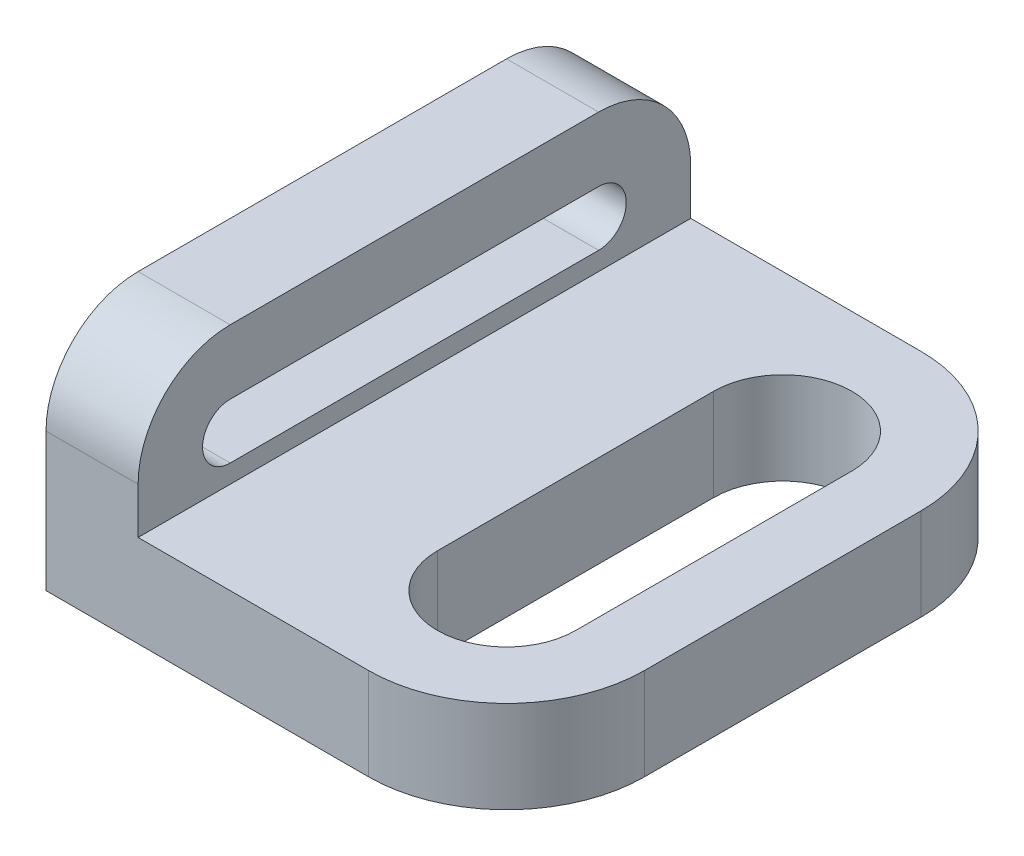
ISO-10303-21;
HEADER;
FILE_DESCRIPTION(('STEP AP214'),'2;1');
FILE_NAME('part.step','',(''),(''),'','','');
FILE_SCHEMA(('AUTOMOTIVE_DESIGN { 1 0 10303 214 1 1 1 1 }'));
ENDSEC;
DATA;
#1=APPLICATION_CONTEXT('core data for automotive mechanical design processes');
#2=APPLICATION_PROTOCOL_DEFINITION('international standard','automotive_design',2000,#1);
#3=PRODUCT_CONTEXT('',#1,'mechanical');
#4=PRODUCT('Part','Part','',(#3));
#5=PRODUCT_RELATED_PRODUCT_CATEGORY('part','',(#4));
#6=PRODUCT_DEFINITION_FORMATION('','',#4);
#7=PRODUCT_DEFINITION_CONTEXT('part definition',#1,'design');
#8=PRODUCT_DEFINITION('design','',#6,#7);
#9=PRODUCT_DEFINITION_SHAPE('','',#8);
#10=(LENGTH_UNIT() NAMED_UNIT(*) SI_UNIT(.MILLI.,.METRE.));
#11=(NAMED_UNIT(*) PLANE_ANGLE_UNIT() SI_UNIT($,.RADIAN.));
#12=(NAMED_UNIT(*) SI_UNIT($,.STERADIAN.) SOLID_ANGLE_UNIT());
#13=UNCERTAINTY_MEASURE_WITH_UNIT(LENGTH_MEASURE(1.E-05),#10,'distance_accuracy_value','');
#14=(GEOMETRIC_REPRESENTATION_CONTEXT(3) GLOBAL_UNCERTAINTY_ASSIGNED_CONTEXT((#13)) GLOBAL_UNIT_ASSIGNED_CONTEXT((#10,
#11,#12)) REPRESENTATION_CONTEXT('',''));
#15=CARTESIAN_POINT('',(0.,0.,0.));
#16=DIRECTION('',(0.,0.,1.));
#17=DIRECTION('',(1.,0.,0.));
#18=AXIS2_PLACEMENT_3D('',#15,#16,#17);
#19=CARTESIAN_POINT('',(10.,30.,40.));
#20=DIRECTION('',(-1.,0.,0.));
#21=DIRECTION('',(0.,0.,1.));
#22=AXIS2_PLACEMENT_3D('',#19,#20,#21);
#23=PLANE('',#22);
#24=DIRECTION('',(0.,-1.,0.));
#25=VECTOR('',#24,1.);
#26=CARTESIAN_POINT('',(10.,0.,60.));
#27=LINE('',#26,#25);
#28=CARTESIAN_POINT('',(10.,29.9999999999999,60.));
#29=VERTEX_POINT('',#28);
#30=CARTESIAN_POINT('',(10.,20.,60.));
#31=VERTEX_POINT('',#30);
#32=EDGE_CURVE('E266',#29,#31,#27,.T.);
#33=ORIENTED_EDGE('',*,*,#32,.T.);
#34=DIRECTION('',(0.,0.,-1.));
#35=VECTOR('',#34,1.);
#36=CARTESIAN_POINT('',(10.,20.,-60.));
#37=LINE('',#36,#35);
#38=CARTESIAN_POINT('',(10.,20.,-60.));
#39=VERTEX_POINT('',#38);
#40=EDGE_CURVE('E203',#31,#39,#37,.T.);
#41=ORIENTED_EDGE('',*,*,#40,.T.);
#42=DIRECTION('',(0.,1.,0.));
#43=VECTOR('',#42,1.);
#44=CARTESIAN_POINT('',(10.,0.,-60.));
#45=LINE('',#44,#43);
#46=CARTESIAN_POINT('',(10.,29.9999999999999,-60.));
#47=VERTEX_POINT('',#46);
#48=EDGE_CURVE('E269',#39,#47,#45,.T.);
#49=ORIENTED_EDGE('',*,*,#48,.T.);
#50=CARTESIAN_POINT('',(10.,30.,-40.));
#51=DIRECTION('',(1.,0.,0.));
#52=DIRECTION('',(0.,0.,1.));
#53=AXIS2_PLACEMENT_3D('',#50,#51,#52);
#54=CIRCLE('',#53,20.);
#55=CARTESIAN_POINT('',(10.,50.,-39.9999999999999));
#56=VERTEX_POINT('',#55);
#57=EDGE_CURVE('E272',#47,#56,#54,.T.);
#58=ORIENTED_EDGE('',*,*,#57,.T.);
#59=DIRECTION('',(0.,0.,1.));
#60=VECTOR('',#59,1.);
#61=CARTESIAN_POINT('',(10.,50.,39.9999999999999));
#62=LINE('',#61,#60);
#63=CARTESIAN_POINT('',(10.,50.,39.9999999999999));
#64=VERTEX_POINT('',#63);
#65=EDGE_CURVE('E274',#56,#64,#62,.T.);
#66=ORIENTED_EDGE('',*,*,#65,.T.);
#67=CARTESIAN_POINT('',(10.,30.,40.));
#68=DIRECTION('',(1.,0.,0.));
#69=DIRECTION('',(0.,0.,1.));
#70=AXIS2_PLACEMENT_3D('',#67,#68,#69);
#71=CIRCLE('',#70,20.);
#72=EDGE_CURVE('E276',#64,#29,#71,.T.);
#73=ORIENTED_EDGE('',*,*,#72,.T.);
#74=EDGE_LOOP('',(#33,#41,#49,#58,#66,#73));
#75=FACE_BOUND('',#74,.T.);
#76=CARTESIAN_POINT('',(10.,30.,40.));
#77=DIRECTION('',(1.,0.,0.));
#78=DIRECTION('',(0.,0.,-1.));
#79=AXIS2_PLACEMENT_3D('',#76,#77,#78);
#80=CIRCLE('',#79,6.);
#81=CARTESIAN_POINT('',(10.,36.,40.));
#82=VERTEX_POINT('',#81);
#83=CARTESIAN_POINT('',(10.,24.,40.));
#84=VERTEX_POINT('',#83);
#85=EDGE_CURVE('E237',#82,#84,#80,.T.);
#86=ORIENTED_EDGE('',*,*,#85,.F.);
#87=DIRECTION('',(0.,0.,1.));
#88=VECTOR('',#87,1.);
#89=CARTESIAN_POINT('',(10.,36.,40.));
#90=LINE('',#89,#88);
#91=CARTESIAN_POINT('',(10.,36.,-40.));
#92=VERTEX_POINT('',#91);
#93=EDGE_CURVE('E244',#92,#82,#90,.T.);
#94=ORIENTED_EDGE('',*,*,#93,.F.);
#95=CARTESIAN_POINT('',(10.,30.,-40.));
#96=DIRECTION('',(1.,0.,0.));
#97=DIRECTION('',(0.,0.,-1.));
#98=AXIS2_PLACEMENT_3D('',#95,#96,#97);
#99=CIRCLE('',#98,6.);
#100=CARTESIAN_POINT('',(10.,24.,-40.));
#101=VERTEX_POINT('',#100);
#102=EDGE_CURVE('E242',#101,#92,#99,.T.);
#103=ORIENTED_EDGE('',*,*,#102,.F.);
#104=DIRECTION('',(0.,0.,-1.));
#105=VECTOR('',#104,1.);
#106=CARTESIAN_POINT('',(10.,24.,40.));
#107=LINE('',#106,#105);
#108=EDGE_CURVE('E239',#84,#101,#107,.T.);
#109=ORIENTED_EDGE('',*,*,#108,.F.);
#110=EDGE_LOOP('',(#86,#94,#103,#109));
#111=FACE_BOUND('',#110,.T.);
#112=ADVANCED_FACE('F34',(#75,#111),#23,.F.);
#113=CARTESIAN_POINT('',(-10.,30.,40.));
#114=DIRECTION('',(-1.,0.,0.));
#115=DIRECTION('',(0.,0.,1.));
#116=AXIS2_PLACEMENT_3D('',#113,#114,#115);
#117=PLANE('',#116);
#118=DIRECTION('',(0.,-1.,0.));
#119=VECTOR('',#118,1.);
#120=CARTESIAN_POINT('',(-10.,0.,60.));
#121=LINE('',#120,#119);
#122=CARTESIAN_POINT('',(-10.,29.9999999999999,60.));
#123=VERTEX_POINT('',#122);
#124=CARTESIAN_POINT('',(-10.,0.,60.));
#125=VERTEX_POINT('',#124);
#126=EDGE_CURVE('E265',#123,#125,#121,.T.);
#127=ORIENTED_EDGE('',*,*,#126,.F.);
#128=CARTESIAN_POINT('',(-10.,30.,40.));
#129=DIRECTION('',(1.,0.,0.));
#130=DIRECTION('',(0.,0.,1.));
#131=AXIS2_PLACEMENT_3D('',#128,#129,#130);
#132=CIRCLE('',#131,20.);
#133=CARTESIAN_POINT('',(-10.,50.,39.9999999999999));
#134=VERTEX_POINT('',#133);
#135=EDGE_CURVE('E270',#134,#123,#132,.T.);
#136=ORIENTED_EDGE('',*,*,#135,.F.);
#137=DIRECTION('',(0.,0.,1.));
#138=VECTOR('',#137,1.);
#139=CARTESIAN_POINT('',(-10.,50.,39.9999999999999));
#140=LINE('',#139,#138);
#141=CARTESIAN_POINT('',(-10.,50.,-39.9999999999999));
#142=VERTEX_POINT('',#141);
#143=EDGE_CURVE('E287',#142,#134,#140,.T.);
#144=ORIENTED_EDGE('',*,*,#143,.F.);
#145=CARTESIAN_POINT('',(-10.,30.,-40.));
#146=DIRECTION('',(1.,0.,0.));
#147=DIRECTION('',(0.,0.,1.));
#148=AXIS2_PLACEMENT_3D('',#145,#146,#147);
#149=CIRCLE('',#148,20.);
#150=CARTESIAN_POINT('',(-10.,29.9999999999999,-60.));
#151=VERTEX_POINT('',#150);
#152=EDGE_CURVE('E285',#151,#142,#149,.T.);
#153=ORIENTED_EDGE('',*,*,#152,.F.);
#154=DIRECTION('',(0.,1.,0.));
#155=VECTOR('',#154,1.);
#156=CARTESIAN_POINT('',(-10.,0.,-60.));
#157=LINE('',#156,#155);
#158=CARTESIAN_POINT('',(-10.,0.,-60.));
#159=VERTEX_POINT('',#158);
#160=EDGE_CURVE('E283',#159,#151,#157,.T.);
#161=ORIENTED_EDGE('',*,*,#160,.F.);
#162=DIRECTION('',(0.,0.,-1.));
#163=VECTOR('',#162,1.);
#164=CARTESIAN_POINT('',(-10.,0.,60.));
#165=LINE('',#164,#163);
#166=EDGE_CURVE('E281',#125,#159,#165,.T.);
#167=ORIENTED_EDGE('',*,*,#166,.F.);
#168=EDGE_LOOP('',(#127,#136,#144,#153,#161,#167));
#169=FACE_BOUND('',#168,.T.);
#170=DIRECTION('',(0.,0.,1.));
#171=VECTOR('',#170,1.);
#172=CARTESIAN_POINT('',(-10.,36.,40.));
#173=LINE('',#172,#171);
#174=CARTESIAN_POINT('',(-10.,36.,-40.));
#175=VERTEX_POINT('',#174);
#176=CARTESIAN_POINT('',(-10.,36.,40.));
#177=VERTEX_POINT('',#176);
#178=EDGE_CURVE('E240',#175,#177,#173,.T.);
#179=ORIENTED_EDGE('',*,*,#178,.T.);
#180=CARTESIAN_POINT('',(-10.,30.,40.));
#181=DIRECTION('',(1.,0.,0.));
#182=DIRECTION('',(0.,0.,-1.));
#183=AXIS2_PLACEMENT_3D('',#180,#181,#182);
#184=CIRCLE('',#183,6.);
#185=CARTESIAN_POINT('',(-10.,24.,40.));
#186=VERTEX_POINT('',#185);
#187=EDGE_CURVE('E230',#177,#186,#184,.T.);
#188=ORIENTED_EDGE('',*,*,#187,.T.);
#189=DIRECTION('',(0.,0.,-1.));
#190=VECTOR('',#189,1.);
#191=CARTESIAN_POINT('',(-10.,24.,40.));
#192=LINE('',#191,#190);
#193=CARTESIAN_POINT('',(-10.,24.,-40.));
#194=VERTEX_POINT('',#193);
#195=EDGE_CURVE('E249',#186,#194,#192,.T.);
#196=ORIENTED_EDGE('',*,*,#195,.T.);
#197=CARTESIAN_POINT('',(-10.,30.,-40.));
#198=DIRECTION('',(1.,0.,0.));
#199=DIRECTION('',(0.,0.,-1.));
#200=AXIS2_PLACEMENT_3D('',#197,#198,#199);
#201=CIRCLE('',#200,6.);
#202=EDGE_CURVE('E252',#194,#175,#201,.T.);
#203=ORIENTED_EDGE('',*,*,#202,.T.);
#204=EDGE_LOOP('',(#179,#188,#196,#203));
#205=FACE_BOUND('',#204,.T.);
#206=ADVANCED_FACE('F310',(#169,#205),#117,.T.);
#207=CARTESIAN_POINT('',(10.,0.,60.));
#208=DIRECTION('',(0.,0.,-1.));
#209=DIRECTION('',(-1.,0.,0.));
#210=AXIS2_PLACEMENT_3D('',#207,#208,#209);
#211=PLANE('',#210);
#212=ORIENTED_EDGE('',*,*,#126,.T.);
#213=DIRECTION('',(-1.,0.,0.));
#214=VECTOR('',#213,1.);
#215=CARTESIAN_POINT('',(10.,0.,60.));
#216=LINE('',#215,#214);
#217=CARTESIAN_POINT('',(59.9999999999998,0.,60.));
#218=VERTEX_POINT('',#217);
#219=EDGE_CURVE('E11',#218,#125,#216,.T.);
#220=ORIENTED_EDGE('',*,*,#219,.F.);
#221=DIRECTION('',(0.,-1.,0.));
#222=VECTOR('',#221,1.);
#223=CARTESIAN_POINT('',(59.9999999999998,20.,60.));
#224=LINE('',#223,#222);
#225=CARTESIAN_POINT('',(59.9999999999998,20.,60.));
#226=VERTEX_POINT('',#225);
#227=EDGE_CURVE('E227',#226,#218,#224,.T.);
#228=ORIENTED_EDGE('',*,*,#227,.F.);
#229=DIRECTION('',(-1.,0.,0.));
#230=VECTOR('',#229,1.);
#231=CARTESIAN_POINT('',(10.,20.,60.));
#232=LINE('',#231,#230);
#233=EDGE_CURVE('E216',#226,#31,#232,.T.);
#234=ORIENTED_EDGE('',*,*,#233,.T.);
#235=ORIENTED_EDGE('',*,*,#32,.F.);
#236=DIRECTION('',(-1.,0.,0.));
#237=VECTOR('',#236,1.);
#238=CARTESIAN_POINT('',(10.,29.9999999999999,60.));
#239=LINE('',#238,#237);
#240=EDGE_CURVE('E278',#29,#123,#239,.T.);
#241=ORIENTED_EDGE('',*,*,#240,.T.);
#242=EDGE_LOOP('',(#212,#220,#228,#234,#235,#241));
#243=FACE_BOUND('',#242,.T.);
#244=ADVANCED_FACE('F36',(#243),#211,.F.);
#245=CARTESIAN_POINT('',(10.,0.,60.));
#246=DIRECTION('',(0.,1.,0.));
#247=DIRECTION('',(0.,0.,1.));
#248=AXIS2_PLACEMENT_3D('',#245,#246,#247);
#249=PLANE('',#248);
#250=ORIENTED_EDGE('',*,*,#166,.T.);
#251=DIRECTION('',(-1.,0.,0.));
#252=VECTOR('',#251,1.);
#253=CARTESIAN_POINT('',(10.,0.,-60.));
#254=LINE('',#253,#252);
#255=CARTESIAN_POINT('',(59.9999999999998,0.,-60.));
#256=VERTEX_POINT('',#255);
#257=EDGE_CURVE('E42',#256,#159,#254,.T.);
#258=ORIENTED_EDGE('',*,*,#257,.F.);
#259=CARTESIAN_POINT('',(60.,0.,-30.));
#260=DIRECTION('',(0.,-1.,0.));
#261=DIRECTION('',(0.,0.,-1.));
#262=AXIS2_PLACEMENT_3D('',#259,#260,#261);
#263=CIRCLE('',#262,30.);
#264=CARTESIAN_POINT('',(90.,0.,-29.9999999999998));
#265=VERTEX_POINT('',#264);
#266=EDGE_CURVE('E199',#256,#265,#263,.T.);
#267=ORIENTED_EDGE('',*,*,#266,.T.);
#268=DIRECTION('',(0.,0.,1.));
#269=VECTOR('',#268,1.);
#270=CARTESIAN_POINT('',(90.,0.,-29.9999999999998));
#271=LINE('',#270,#269);
#272=CARTESIAN_POINT('',(90.,0.,29.9999999999998));
#273=VERTEX_POINT('',#272);
#274=EDGE_CURVE('E222',#265,#273,#271,.T.);
#275=ORIENTED_EDGE('',*,*,#274,.T.);
#276=CARTESIAN_POINT('',(60.,0.,30.));
#277=DIRECTION('',(0.,-1.,0.));
#278=DIRECTION('',(0.,0.,1.));
#279=AXIS2_PLACEMENT_3D('',#276,#277,#278);
#280=CIRCLE('',#279,30.);
#281=EDGE_CURVE('E205',#273,#218,#280,.T.);
#282=ORIENTED_EDGE('',*,*,#281,.T.);
#283=ORIENTED_EDGE('',*,*,#219,.T.);
#284=EDGE_LOOP('',(#250,#258,#267,#275,#282,#283));
#285=FACE_BOUND('',#284,.T.);
#286=DIRECTION('',(0.,0.,1.));
#287=VECTOR('',#286,1.);
#288=CARTESIAN_POINT('',(75.,0.,-30.));
#289=LINE('',#288,#287);
#290=CARTESIAN_POINT('',(75.,0.,-30.));
#291=VERTEX_POINT('',#290);
#292=CARTESIAN_POINT('',(75.,0.,30.));
#293=VERTEX_POINT('',#292);
#294=EDGE_CURVE('E193',#291,#293,#289,.T.);
#295=ORIENTED_EDGE('',*,*,#294,.F.);
#296=CARTESIAN_POINT('',(60.,0.,-30.));
#297=DIRECTION('',(0.,-1.,0.));
#298=DIRECTION('',(0.,0.,-1.));
#299=AXIS2_PLACEMENT_3D('',#296,#297,#298);
#300=CIRCLE('',#299,15.);
#301=CARTESIAN_POINT('',(45.,0.,-30.));
#302=VERTEX_POINT('',#301);
#303=EDGE_CURVE('E167',#302,#291,#300,.T.);
#304=ORIENTED_EDGE('',*,*,#303,.F.);
#305=DIRECTION('',(0.,0.,-1.));
#306=VECTOR('',#305,1.);
#307=CARTESIAN_POINT('',(45.,0.,-30.));
#308=LINE('',#307,#306);
#309=CARTESIAN_POINT('',(45.,0.,30.));
#310=VERTEX_POINT('',#309);
#311=EDGE_CURVE('E184',#310,#302,#308,.T.);
#312=ORIENTED_EDGE('',*,*,#311,.F.);
#313=CARTESIAN_POINT('',(60.,0.,30.));
#314=DIRECTION('',(0.,-1.,0.));
#315=DIRECTION('',(0.,0.,-1.));
#316=AXIS2_PLACEMENT_3D('',#313,#314,#315);
#317=CIRCLE('',#316,15.);
#318=EDGE_CURVE('E187',#293,#310,#317,.T.);
#319=ORIENTED_EDGE('',*,*,#318,.F.);
#320=EDGE_LOOP('',(#295,#304,#312,#319));
#321=FACE_BOUND('',#320,.T.);
#322=ADVANCED_FACE('F340',(#285,#321),#249,.F.);
#323=CARTESIAN_POINT('',(10.,0.,-60.));
#324=DIRECTION('',(0.,0.,1.));
#325=DIRECTION('',(1.,0.,0.));
#326=AXIS2_PLACEMENT_3D('',#323,#324,#325);
#327=PLANE('',#326);
#328=ORIENTED_EDGE('',*,*,#160,.T.);
#329=DIRECTION('',(-1.,0.,0.));
#330=VECTOR('',#329,1.);
#331=CARTESIAN_POINT('',(10.,29.9999999999999,-60.));
#332=LINE('',#331,#330);
#333=EDGE_CURVE('E298',#47,#151,#332,.T.);
#334=ORIENTED_EDGE('',*,*,#333,.F.);
#335=ORIENTED_EDGE('',*,*,#48,.F.);
#336=DIRECTION('',(1.,0.,0.));
#337=VECTOR('',#336,1.);
#338=CARTESIAN_POINT('',(10.,20.,-60.));
#339=LINE('',#338,#337);
#340=CARTESIAN_POINT('',(59.9999999999998,20.,-60.));
#341=VERTEX_POINT('',#340);
#342=EDGE_CURVE('E49',#39,#341,#339,.T.);
#343=ORIENTED_EDGE('',*,*,#342,.T.);
#344=DIRECTION('',(0.,-1.,0.));
#345=VECTOR('',#344,1.);
#346=CARTESIAN_POINT('',(59.9999999999998,20.,-60.));
#347=LINE('',#346,#345);
#348=EDGE_CURVE('E219',#341,#256,#347,.T.);
#349=ORIENTED_EDGE('',*,*,#348,.T.);
#350=ORIENTED_EDGE('',*,*,#257,.T.);
#351=EDGE_LOOP('',(#328,#334,#335,#343,#349,#350));
#352=FACE_BOUND('',#351,.T.);
#353=ADVANCED_FACE('F303',(#352),#327,.F.);
#354=CARTESIAN_POINT('',(10.,30.,-40.));
#355=DIRECTION('',(-1.,0.,0.));
#356=DIRECTION('',(0.,0.,1.));
#357=AXIS2_PLACEMENT_3D('',#354,#355,#356);
#358=CYLINDRICAL_SURFACE('',#357,20.);
#359=ORIENTED_EDGE('',*,*,#152,.T.);
#360=DIRECTION('',(-1.,0.,0.));
#361=VECTOR('',#360,1.);
#362=CARTESIAN_POINT('',(10.,50.,-39.9999999999999));
#363=LINE('',#362,#361);
#364=EDGE_CURVE('E295',#56,#142,#363,.T.);
#365=ORIENTED_EDGE('',*,*,#364,.F.);
#366=ORIENTED_EDGE('',*,*,#57,.F.);
#367=ORIENTED_EDGE('',*,*,#333,.T.);
#368=EDGE_LOOP('',(#359,#365,#366,#367));
#369=FACE_BOUND('',#368,.T.);
#370=ADVANCED_FACE('F316',(#369),#358,.T.);
#371=CARTESIAN_POINT('',(10.,50.,39.9999999999999));
#372=DIRECTION('',(0.,-1.,0.));
#373=DIRECTION('',(0.,0.,-1.));
#374=AXIS2_PLACEMENT_3D('',#371,#372,#373);
#375=PLANE('',#374);
#376=ORIENTED_EDGE('',*,*,#143,.T.);
#377=DIRECTION('',(-1.,0.,0.));
#378=VECTOR('',#377,1.);
#379=CARTESIAN_POINT('',(10.,50.,39.9999999999999));
#380=LINE('',#379,#378);
#381=EDGE_CURVE('E292',#64,#134,#380,.T.);
#382=ORIENTED_EDGE('',*,*,#381,.F.);
#383=ORIENTED_EDGE('',*,*,#65,.F.);
#384=ORIENTED_EDGE('',*,*,#364,.T.);
#385=EDGE_LOOP('',(#376,#382,#383,#384));
#386=FACE_BOUND('',#385,.T.);
#387=ADVANCED_FACE('F320',(#386),#375,.F.);
#388=CARTESIAN_POINT('',(10.,30.,40.));
#389=DIRECTION('',(-1.,0.,0.));
#390=DIRECTION('',(0.,0.,1.));
#391=AXIS2_PLACEMENT_3D('',#388,#389,#390);
#392=CYLINDRICAL_SURFACE('',#391,20.);
#393=ORIENTED_EDGE('',*,*,#135,.T.);
#394=ORIENTED_EDGE('',*,*,#240,.F.);
#395=ORIENTED_EDGE('',*,*,#72,.F.);
#396=ORIENTED_EDGE('',*,*,#381,.T.);
#397=EDGE_LOOP('',(#393,#394,#395,#396));
#398=FACE_BOUND('',#397,.T.);
#399=ADVANCED_FACE('F343',(#398),#392,.T.);
#400=CARTESIAN_POINT('',(10.,30.,40.));
#401=DIRECTION('',(-1.,0.,0.));
#402=DIRECTION('',(0.,0.,1.));
#403=AXIS2_PLACEMENT_3D('',#400,#401,#402);
#404=CYLINDRICAL_SURFACE('',#403,6.);
#405=ORIENTED_EDGE('',*,*,#187,.F.);
#406=DIRECTION('',(-1.,0.,0.));
#407=VECTOR('',#406,1.);
#408=CARTESIAN_POINT('',(10.,36.,40.));
#409=LINE('',#408,#407);
#410=EDGE_CURVE('E246',#82,#177,#409,.T.);
#411=ORIENTED_EDGE('',*,*,#410,.F.);
#412=ORIENTED_EDGE('',*,*,#85,.T.);
#413=DIRECTION('',(-1.,0.,0.));
#414=VECTOR('',#413,1.);
#415=CARTESIAN_POINT('',(10.,24.,40.));
#416=LINE('',#415,#414);
#417=EDGE_CURVE('E262',#84,#186,#416,.T.);
#418=ORIENTED_EDGE('',*,*,#417,.T.);
#419=EDGE_LOOP('',(#405,#411,#412,#418));
#420=FACE_BOUND('',#419,.T.);
#421=ADVANCED_FACE('F345',(#420),#404,.F.);
#422=CARTESIAN_POINT('',(10.,24.,40.));
#423=DIRECTION('',(0.,1.,0.));
#424=DIRECTION('',(0.,0.,1.));
#425=AXIS2_PLACEMENT_3D('',#422,#423,#424);
#426=PLANE('',#425);
#427=ORIENTED_EDGE('',*,*,#195,.F.);
#428=ORIENTED_EDGE('',*,*,#417,.F.);
#429=ORIENTED_EDGE('',*,*,#108,.T.);
#430=DIRECTION('',(-1.,0.,0.));
#431=VECTOR('',#430,1.);
#432=CARTESIAN_POINT('',(10.,24.,-40.));
#433=LINE('',#432,#431);
#434=EDGE_CURVE('E260',#101,#194,#433,.T.);
#435=ORIENTED_EDGE('',*,*,#434,.T.);
#436=EDGE_LOOP('',(#427,#428,#429,#435));
#437=FACE_BOUND('',#436,.T.);
#438=ADVANCED_FACE('F351',(#437),#426,.T.);
#439=CARTESIAN_POINT('',(10.,30.,-40.));
#440=DIRECTION('',(-1.,0.,0.));
#441=DIRECTION('',(0.,0.,1.));
#442=AXIS2_PLACEMENT_3D('',#439,#440,#441);
#443=CYLINDRICAL_SURFACE('',#442,6.);
#444=ORIENTED_EDGE('',*,*,#202,.F.);
#445=ORIENTED_EDGE('',*,*,#434,.F.);
#446=ORIENTED_EDGE('',*,*,#102,.T.);
#447=DIRECTION('',(-1.,0.,0.));
#448=VECTOR('',#447,1.);
#449=CARTESIAN_POINT('',(10.,36.,-40.));
#450=LINE('',#449,#448);
#451=EDGE_CURVE('E57',#92,#175,#450,.T.);
#452=ORIENTED_EDGE('',*,*,#451,.T.);
#453=EDGE_LOOP('',(#444,#445,#446,#452));
#454=FACE_BOUND('',#453,.T.);
#455=ADVANCED_FACE('F364',(#454),#443,.F.);
#456=CARTESIAN_POINT('',(10.,36.,40.));
#457=DIRECTION('',(0.,-1.,0.));
#458=DIRECTION('',(0.,0.,-1.));
#459=AXIS2_PLACEMENT_3D('',#456,#457,#458);
#460=PLANE('',#459);
#461=ORIENTED_EDGE('',*,*,#178,.F.);
#462=ORIENTED_EDGE('',*,*,#451,.F.);
#463=ORIENTED_EDGE('',*,*,#93,.T.);
#464=ORIENTED_EDGE('',*,*,#410,.T.);
#465=EDGE_LOOP('',(#461,#462,#463,#464));
#466=FACE_BOUND('',#465,.T.);
#467=ADVANCED_FACE('F368',(#466),#460,.T.);
#468=CARTESIAN_POINT('',(60.,20.,30.));
#469=DIRECTION('',(0.,-1.,0.));
#470=DIRECTION('',(0.,0.,-1.));
#471=AXIS2_PLACEMENT_3D('',#468,#469,#470);
#472=CYLINDRICAL_SURFACE('',#471,30.);
#473=ORIENTED_EDGE('',*,*,#281,.F.);
#474=DIRECTION('',(0.,-1.,0.));
#475=VECTOR('',#474,1.);
#476=CARTESIAN_POINT('',(90.,20.,29.9999999999998));
#477=LINE('',#476,#475);
#478=CARTESIAN_POINT('',(90.,20.,29.9999999999998));
#479=VERTEX_POINT('',#478);
#480=EDGE_CURVE('E231',#479,#273,#477,.T.);
#481=ORIENTED_EDGE('',*,*,#480,.F.);
#482=CARTESIAN_POINT('',(60.,20.,30.));
#483=DIRECTION('',(0.,-1.,0.));
#484=DIRECTION('',(0.,0.,1.));
#485=AXIS2_PLACEMENT_3D('',#482,#483,#484);
#486=CIRCLE('',#485,30.);
#487=EDGE_CURVE('E213',#479,#226,#486,.T.);
#488=ORIENTED_EDGE('',*,*,#487,.T.);
#489=ORIENTED_EDGE('',*,*,#227,.T.);
#490=EDGE_LOOP('',(#473,#481,#488,#489));
#491=FACE_BOUND('',#490,.T.);
#492=ADVANCED_FACE('F333',(#491),#472,.T.);
#493=CARTESIAN_POINT('',(90.,20.,-29.9999999999998));
#494=DIRECTION('',(1.,0.,0.));
#495=DIRECTION('',(0.,0.,-1.));
#496=AXIS2_PLACEMENT_3D('',#493,#494,#495);
#497=PLANE('',#496);
#498=ORIENTED_EDGE('',*,*,#274,.F.);
#499=DIRECTION('',(0.,-1.,0.));
#500=VECTOR('',#499,1.);
#501=CARTESIAN_POINT('',(90.,20.,-29.9999999999998));
#502=LINE('',#501,#500);
#503=CARTESIAN_POINT('',(90.,20.,-29.9999999999998));
#504=VERTEX_POINT('',#503);
#505=EDGE_CURVE('E233',#504,#265,#502,.T.);
#506=ORIENTED_EDGE('',*,*,#505,.F.);
#507=DIRECTION('',(0.,0.,1.));
#508=VECTOR('',#507,1.);
#509=CARTESIAN_POINT('',(90.,20.,-29.9999999999998));
#510=LINE('',#509,#508);
#511=EDGE_CURVE('E210',#504,#479,#510,.T.);
#512=ORIENTED_EDGE('',*,*,#511,.T.);
#513=ORIENTED_EDGE('',*,*,#480,.T.);
#514=EDGE_LOOP('',(#498,#506,#512,#513));
#515=FACE_BOUND('',#514,.T.);
#516=ADVANCED_FACE('F337',(#515),#497,.T.);
#517=CARTESIAN_POINT('',(60.,20.,-30.));
#518=DIRECTION('',(0.,-1.,0.));
#519=DIRECTION('',(0.,0.,-1.));
#520=AXIS2_PLACEMENT_3D('',#517,#518,#519);
#521=CYLINDRICAL_SURFACE('',#520,30.);
#522=ORIENTED_EDGE('',*,*,#266,.F.);
#523=ORIENTED_EDGE('',*,*,#348,.F.);
#524=CARTESIAN_POINT('',(60.,20.,-30.));
#525=DIRECTION('',(0.,-1.,0.));
#526=DIRECTION('',(0.,0.,-1.));
#527=AXIS2_PLACEMENT_3D('',#524,#525,#526);
#528=CIRCLE('',#527,30.);
#529=EDGE_CURVE('E207',#341,#504,#528,.T.);
#530=ORIENTED_EDGE('',*,*,#529,.T.);
#531=ORIENTED_EDGE('',*,*,#505,.T.);
#532=EDGE_LOOP('',(#522,#523,#530,#531));
#533=FACE_BOUND('',#532,.T.);
#534=ADVANCED_FACE('F339',(#533),#521,.T.);
#535=CARTESIAN_POINT('',(60.,20.,30.));
#536=DIRECTION('',(0.,1.,0.));
#537=DIRECTION('',(0.,0.,1.));
#538=AXIS2_PLACEMENT_3D('',#535,#536,#537);
#539=PLANE('',#538);
#540=CARTESIAN_POINT('',(60.,20.,-30.));
#541=DIRECTION('',(0.,-1.,0.));
#542=DIRECTION('',(0.,0.,-1.));
#543=AXIS2_PLACEMENT_3D('',#540,#541,#542);
#544=CIRCLE('',#543,15.);
#545=CARTESIAN_POINT('',(45.,20.,-30.));
#546=VERTEX_POINT('',#545);
#547=CARTESIAN_POINT('',(75.,20.,-30.));
#548=VERTEX_POINT('',#547);
#549=EDGE_CURVE('E164',#546,#548,#544,.T.);
#550=ORIENTED_EDGE('',*,*,#549,.T.);
#551=DIRECTION('',(0.,0.,1.));
#552=VECTOR('',#551,1.);
#553=CARTESIAN_POINT('',(75.,20.,-30.));
#554=LINE('',#553,#552);
#555=CARTESIAN_POINT('',(75.,20.,30.));
#556=VERTEX_POINT('',#555);
#557=EDGE_CURVE('E176',#548,#556,#554,.T.);
#558=ORIENTED_EDGE('',*,*,#557,.T.);
#559=CARTESIAN_POINT('',(60.,20.,30.));
#560=DIRECTION('',(0.,-1.,0.));
#561=DIRECTION('',(0.,0.,-1.));
#562=AXIS2_PLACEMENT_3D('',#559,#560,#561);
#563=CIRCLE('',#562,15.);
#564=CARTESIAN_POINT('',(45.,20.,30.));
#565=VERTEX_POINT('',#564);
#566=EDGE_CURVE('E180',#556,#565,#563,.T.);
#567=ORIENTED_EDGE('',*,*,#566,.T.);
#568=DIRECTION('',(0.,0.,-1.));
#569=VECTOR('',#568,1.);
#570=CARTESIAN_POINT('',(45.,20.,-30.));
#571=LINE('',#570,#569);
#572=EDGE_CURVE('E172',#565,#546,#571,.T.);
#573=ORIENTED_EDGE('',*,*,#572,.T.);
#574=EDGE_LOOP('',(#550,#558,#567,#573));
#575=FACE_BOUND('',#574,.T.);
#576=ORIENTED_EDGE('',*,*,#40,.F.);
#577=ORIENTED_EDGE('',*,*,#233,.F.);
#578=ORIENTED_EDGE('',*,*,#487,.F.);
#579=ORIENTED_EDGE('',*,*,#511,.F.);
#580=ORIENTED_EDGE('',*,*,#529,.F.);
#581=ORIENTED_EDGE('',*,*,#342,.F.);
#582=EDGE_LOOP('',(#576,#577,#578,#579,#580,#581));
#583=FACE_BOUND('',#582,.T.);
#584=ADVANCED_FACE('F182',(#575,#583),#539,.T.);
#585=CARTESIAN_POINT('',(60.,20.,-30.));
#586=DIRECTION('',(0.,-1.,0.));
#587=DIRECTION('',(0.,0.,-1.));
#588=AXIS2_PLACEMENT_3D('',#585,#586,#587);
#589=CYLINDRICAL_SURFACE('',#588,15.);
#590=ORIENTED_EDGE('',*,*,#303,.T.);
#591=DIRECTION('',(0.,-1.,0.));
#592=VECTOR('',#591,1.);
#593=CARTESIAN_POINT('',(75.,20.,-30.));
#594=LINE('',#593,#592);
#595=EDGE_CURVE('E160',#548,#291,#594,.T.);
#596=ORIENTED_EDGE('',*,*,#595,.F.);
#597=ORIENTED_EDGE('',*,*,#549,.F.);
#598=DIRECTION('',(0.,-1.,0.));
#599=VECTOR('',#598,1.);
#600=CARTESIAN_POINT('',(45.,20.,-30.));
#601=LINE('',#600,#599);
#602=EDGE_CURVE('E197',#546,#302,#601,.T.);
#603=ORIENTED_EDGE('',*,*,#602,.T.);
#604=EDGE_LOOP('',(#590,#596,#597,#603));
#605=FACE_BOUND('',#604,.T.);
#606=ADVANCED_FACE('F162',(#605),#589,.F.);
#607=CARTESIAN_POINT('',(45.,20.,-30.));
#608=DIRECTION('',(-1.,0.,0.));
#609=DIRECTION('',(0.,0.,1.));
#610=AXIS2_PLACEMENT_3D('',#607,#608,#609);
#611=PLANE('',#610);
#612=ORIENTED_EDGE('',*,*,#311,.T.);
#613=ORIENTED_EDGE('',*,*,#602,.F.);
#614=ORIENTED_EDGE('',*,*,#572,.F.);
#615=DIRECTION('',(0.,-1.,0.));
#616=VECTOR('',#615,1.);
#617=CARTESIAN_POINT('',(45.,20.,30.));
#618=LINE('',#617,#616);
#619=EDGE_CURVE('E200',#565,#310,#618,.T.);
#620=ORIENTED_EDGE('',*,*,#619,.T.);
#621=EDGE_LOOP('',(#612,#613,#614,#620));
#622=FACE_BOUND('',#621,.T.);
#623=ADVANCED_FACE('F382',(#622),#611,.F.);
#624=CARTESIAN_POINT('',(60.,20.,30.));
#625=DIRECTION('',(0.,-1.,0.));
#626=DIRECTION('',(0.,0.,-1.));
#627=AXIS2_PLACEMENT_3D('',#624,#625,#626);
#628=CYLINDRICAL_SURFACE('',#627,15.);
#629=ORIENTED_EDGE('',*,*,#318,.T.);
#630=ORIENTED_EDGE('',*,*,#619,.F.);
#631=ORIENTED_EDGE('',*,*,#566,.F.);
#632=DIRECTION('',(0.,-1.,0.));
#633=VECTOR('',#632,1.);
#634=CARTESIAN_POINT('',(75.,20.,30.));
#635=LINE('',#634,#633);
#636=EDGE_CURVE('E171',#556,#293,#635,.T.);
#637=ORIENTED_EDGE('',*,*,#636,.T.);
#638=EDGE_LOOP('',(#629,#630,#631,#637));
#639=FACE_BOUND('',#638,.T.);
#640=ADVANCED_FACE('F385',(#639),#628,.F.);
#641=CARTESIAN_POINT('',(75.,20.,-30.));
#642=DIRECTION('',(1.,0.,0.));
#643=DIRECTION('',(0.,0.,-1.));
#644=AXIS2_PLACEMENT_3D('',#641,#642,#643);
#645=PLANE('',#644);
#646=ORIENTED_EDGE('',*,*,#294,.T.);
#647=ORIENTED_EDGE('',*,*,#636,.F.);
#648=ORIENTED_EDGE('',*,*,#557,.F.);
#649=ORIENTED_EDGE('',*,*,#595,.T.);
#650=EDGE_LOOP('',(#646,#647,#648,#649));
#651=FACE_BOUND('',#650,.T.);
#652=ADVANCED_FACE('F177',(#651),#645,.F.);
#653=CLOSED_SHELL('',(#112,#206,#244,#322,#353,#370,#387,#399,#421,#438,#455,#467,#492,#516,
#534,#584,#606,#623,#640,#652));
#654=MANIFOLD_SOLID_BREP('B2',#653);
#655=ADVANCED_BREP_SHAPE_REPRESENTATION('',(#18,#654),#14);
#656=SHAPE_DEFINITION_REPRESENTATION(#9,#655);
ENDSEC;
END-ISO-10303-21;
